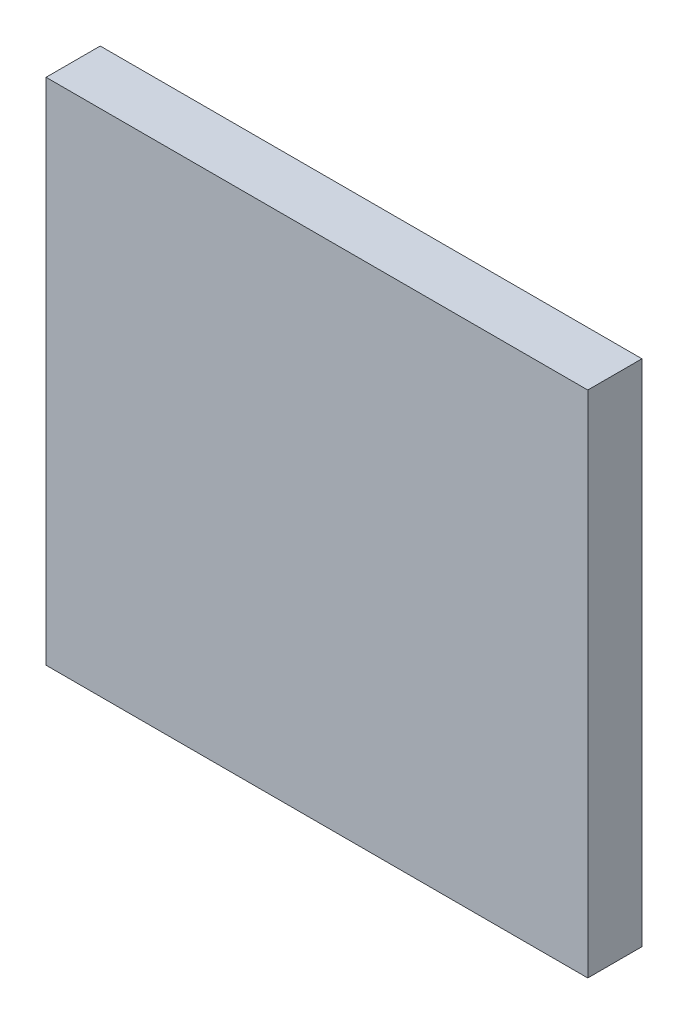
ISO-10303-21;
HEADER;
FILE_DESCRIPTION(('STEP AP214'),'2;1');
FILE_NAME('part.step','',(''),(''),'','','');
FILE_SCHEMA(('AUTOMOTIVE_DESIGN { 1 0 10303 214 1 1 1 1 }'));
ENDSEC;
DATA;
#1=APPLICATION_CONTEXT('core data for automotive mechanical design processes');
#2=APPLICATION_PROTOCOL_DEFINITION('international standard','automotive_design',2000,#1);
#3=PRODUCT_CONTEXT('',#1,'mechanical');
#4=PRODUCT('Part','Part','',(#3));
#5=PRODUCT_RELATED_PRODUCT_CATEGORY('part','',(#4));
#6=PRODUCT_DEFINITION_FORMATION('','',#4);
#7=PRODUCT_DEFINITION_CONTEXT('part definition',#1,'design');
#8=PRODUCT_DEFINITION('design','',#6,#7);
#9=PRODUCT_DEFINITION_SHAPE('','',#8);
#10=(LENGTH_UNIT() NAMED_UNIT(*) SI_UNIT(.MILLI.,.METRE.));
#11=(NAMED_UNIT(*) PLANE_ANGLE_UNIT() SI_UNIT($,.RADIAN.));
#12=(NAMED_UNIT(*) SI_UNIT($,.STERADIAN.) SOLID_ANGLE_UNIT());
#13=UNCERTAINTY_MEASURE_WITH_UNIT(LENGTH_MEASURE(1.E-05),#10,'distance_accuracy_value','');
#14=(GEOMETRIC_REPRESENTATION_CONTEXT(3) GLOBAL_UNCERTAINTY_ASSIGNED_CONTEXT((#13)) GLOBAL_UNIT_ASSIGNED_CONTEXT((#10,
#11,#12)) REPRESENTATION_CONTEXT('',''));
#15=CARTESIAN_POINT('',(0.,0.,0.));
#16=DIRECTION('',(0.,0.,1.));
#17=DIRECTION('',(1.,0.,0.));
#18=AXIS2_PLACEMENT_3D('',#15,#16,#17);
#19=CARTESIAN_POINT('',(50.,-47.,10.));
#20=DIRECTION('',(-1.,0.,0.));
#21=DIRECTION('',(0.,0.,1.));
#22=AXIS2_PLACEMENT_3D('',#19,#20,#21);
#23=PLANE('',#22);
#24=DIRECTION('',(0.,1.,0.));
#25=VECTOR('',#24,1.);
#26=CARTESIAN_POINT('',(50.,-47.,0.));
#27=LINE('',#26,#25);
#28=CARTESIAN_POINT('',(50.,-47.,0.));
#29=VERTEX_POINT('',#28);
#30=CARTESIAN_POINT('',(50.,47.,0.));
#31=VERTEX_POINT('',#30);
#32=EDGE_CURVE('E113',#29,#31,#27,.T.);
#33=ORIENTED_EDGE('',*,*,#32,.T.);
#34=DIRECTION('',(0.,0.,-1.));
#35=VECTOR('',#34,1.);
#36=CARTESIAN_POINT('',(50.,47.,10.));
#37=LINE('',#36,#35);
#38=CARTESIAN_POINT('',(50.,47.,10.));
#39=VERTEX_POINT('',#38);
#40=EDGE_CURVE('E11',#39,#31,#37,.T.);
#41=ORIENTED_EDGE('',*,*,#40,.F.);
#42=DIRECTION('',(0.,1.,0.));
#43=VECTOR('',#42,1.);
#44=CARTESIAN_POINT('',(50.,-47.,10.));
#45=LINE('',#44,#43);
#46=CARTESIAN_POINT('',(50.,-47.,10.));
#47=VERTEX_POINT('',#46);
#48=EDGE_CURVE('E97',#47,#39,#45,.T.);
#49=ORIENTED_EDGE('',*,*,#48,.F.);
#50=DIRECTION('',(0.,0.,-1.));
#51=VECTOR('',#50,1.);
#52=CARTESIAN_POINT('',(50.,-47.,10.));
#53=LINE('',#52,#51);
#54=EDGE_CURVE('E109',#47,#29,#53,.T.);
#55=ORIENTED_EDGE('',*,*,#54,.T.);
#56=EDGE_LOOP('',(#33,#41,#49,#55));
#57=FACE_BOUND('',#56,.T.);
#58=ADVANCED_FACE('F45',(#57),#23,.F.);
#59=CARTESIAN_POINT('',(-50.,47.,10.));
#60=DIRECTION('',(0.,-1.,0.));
#61=DIRECTION('',(0.,0.,-1.));
#62=AXIS2_PLACEMENT_3D('',#59,#60,#61);
#63=PLANE('',#62);
#64=DIRECTION('',(-1.,0.,0.));
#65=VECTOR('',#64,1.);
#66=CARTESIAN_POINT('',(-50.,47.,0.));
#67=LINE('',#66,#65);
#68=CARTESIAN_POINT('',(-50.,47.,0.));
#69=VERTEX_POINT('',#68);
#70=EDGE_CURVE('E102',#31,#69,#67,.T.);
#71=ORIENTED_EDGE('',*,*,#70,.T.);
#72=DIRECTION('',(0.,0.,-1.));
#73=VECTOR('',#72,1.);
#74=CARTESIAN_POINT('',(-50.,47.,10.));
#75=LINE('',#74,#73);
#76=CARTESIAN_POINT('',(-50.,47.,10.));
#77=VERTEX_POINT('',#76);
#78=EDGE_CURVE('E54',#77,#69,#75,.T.);
#79=ORIENTED_EDGE('',*,*,#78,.F.);
#80=DIRECTION('',(-1.,0.,0.));
#81=VECTOR('',#80,1.);
#82=CARTESIAN_POINT('',(-50.,47.,10.));
#83=LINE('',#82,#81);
#84=EDGE_CURVE('E92',#39,#77,#83,.T.);
#85=ORIENTED_EDGE('',*,*,#84,.F.);
#86=ORIENTED_EDGE('',*,*,#40,.T.);
#87=EDGE_LOOP('',(#71,#79,#85,#86));
#88=FACE_BOUND('',#87,.T.);
#89=ADVANCED_FACE('F101',(#88),#63,.F.);
#90=CARTESIAN_POINT('',(-50.,-47.,10.));
#91=DIRECTION('',(1.,0.,0.));
#92=DIRECTION('',(0.,0.,-1.));
#93=AXIS2_PLACEMENT_3D('',#90,#91,#92);
#94=PLANE('',#93);
#95=DIRECTION('',(0.,-1.,0.));
#96=VECTOR('',#95,1.);
#97=CARTESIAN_POINT('',(-50.,-47.,0.));
#98=LINE('',#97,#96);
#99=CARTESIAN_POINT('',(-50.,-47.,0.));
#100=VERTEX_POINT('',#99);
#101=EDGE_CURVE('E79',#69,#100,#98,.T.);
#102=ORIENTED_EDGE('',*,*,#101,.T.);
#103=DIRECTION('',(0.,0.,-1.));
#104=VECTOR('',#103,1.);
#105=CARTESIAN_POINT('',(-50.,-47.,10.));
#106=LINE('',#105,#104);
#107=CARTESIAN_POINT('',(-50.,-47.,10.));
#108=VERTEX_POINT('',#107);
#109=EDGE_CURVE('E104',#108,#100,#106,.T.);
#110=ORIENTED_EDGE('',*,*,#109,.F.);
#111=DIRECTION('',(0.,-1.,0.));
#112=VECTOR('',#111,1.);
#113=CARTESIAN_POINT('',(-50.,-47.,10.));
#114=LINE('',#113,#112);
#115=EDGE_CURVE('E95',#77,#108,#114,.T.);
#116=ORIENTED_EDGE('',*,*,#115,.F.);
#117=ORIENTED_EDGE('',*,*,#78,.T.);
#118=EDGE_LOOP('',(#102,#110,#116,#117));
#119=FACE_BOUND('',#118,.T.);
#120=ADVANCED_FACE('F105',(#119),#94,.F.);
#121=CARTESIAN_POINT('',(-50.,-47.,10.));
#122=DIRECTION('',(0.,1.,0.));
#123=DIRECTION('',(0.,0.,1.));
#124=AXIS2_PLACEMENT_3D('',#121,#122,#123);
#125=PLANE('',#124);
#126=DIRECTION('',(1.,0.,0.));
#127=VECTOR('',#126,1.);
#128=CARTESIAN_POINT('',(-50.,-47.,0.));
#129=LINE('',#128,#127);
#130=EDGE_CURVE('E85',#100,#29,#129,.T.);
#131=ORIENTED_EDGE('',*,*,#130,.T.);
#132=ORIENTED_EDGE('',*,*,#54,.F.);
#133=DIRECTION('',(1.,0.,0.));
#134=VECTOR('',#133,1.);
#135=CARTESIAN_POINT('',(-50.,-47.,10.));
#136=LINE('',#135,#134);
#137=EDGE_CURVE('E62',#108,#47,#136,.T.);
#138=ORIENTED_EDGE('',*,*,#137,.F.);
#139=ORIENTED_EDGE('',*,*,#109,.T.);
#140=EDGE_LOOP('',(#131,#132,#138,#139));
#141=FACE_BOUND('',#140,.T.);
#142=ADVANCED_FACE('F126',(#141),#125,.F.);
#143=CARTESIAN_POINT('',(0.,0.,10.));
#144=DIRECTION('',(0.,0.,-1.));
#145=DIRECTION('',(-1.,0.,0.));
#146=AXIS2_PLACEMENT_3D('',#143,#144,#145);
#147=PLANE('',#146);
#148=ORIENTED_EDGE('',*,*,#48,.T.);
#149=ORIENTED_EDGE('',*,*,#84,.T.);
#150=ORIENTED_EDGE('',*,*,#115,.T.);
#151=ORIENTED_EDGE('',*,*,#137,.T.);
#152=EDGE_LOOP('',(#148,#149,#150,#151));
#153=FACE_BOUND('',#152,.T.);
#154=ADVANCED_FACE('F93',(#153),#147,.F.);
#155=CARTESIAN_POINT('',(0.,0.,0.));
#156=DIRECTION('',(0.,0.,-1.));
#157=DIRECTION('',(-1.,0.,0.));
#158=AXIS2_PLACEMENT_3D('',#155,#156,#157);
#159=PLANE('',#158);
#160=ORIENTED_EDGE('',*,*,#32,.F.);
#161=ORIENTED_EDGE('',*,*,#130,.F.);
#162=ORIENTED_EDGE('',*,*,#101,.F.);
#163=ORIENTED_EDGE('',*,*,#70,.F.);
#164=EDGE_LOOP('',(#160,#161,#162,#163));
#165=FACE_BOUND('',#164,.T.);
#166=ADVANCED_FACE('F129',(#165),#159,.T.);
#167=CLOSED_SHELL('',(#58,#89,#120,#142,#154,#166));
#168=MANIFOLD_SOLID_BREP('B2',#167);
#169=ADVANCED_BREP_SHAPE_REPRESENTATION('',(#18,#168),#14);
#170=SHAPE_DEFINITION_REPRESENTATION(#9,#169);
ENDSEC;
END-ISO-10303-21;
